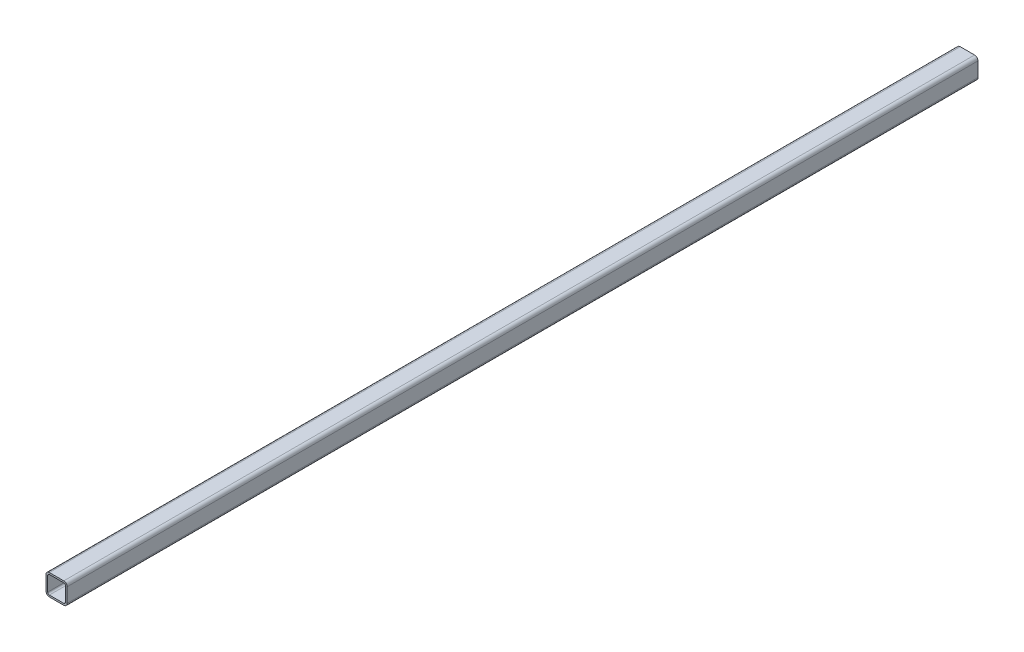
ISO-10303-21;
HEADER;
FILE_DESCRIPTION(('STEP AP214'),'2;1');
FILE_NAME('part.step','',(''),(''),'','','');
FILE_SCHEMA(('AUTOMOTIVE_DESIGN { 1 0 10303 214 1 1 1 1 }'));
ENDSEC;
DATA;
#1=APPLICATION_CONTEXT('core data for automotive mechanical design processes');
#2=APPLICATION_PROTOCOL_DEFINITION('international standard','automotive_design',2000,#1);
#3=PRODUCT_CONTEXT('',#1,'mechanical');
#4=PRODUCT('Part','Part','',(#3));
#5=PRODUCT_RELATED_PRODUCT_CATEGORY('part','',(#4));
#6=PRODUCT_DEFINITION_FORMATION('','',#4);
#7=PRODUCT_DEFINITION_CONTEXT('part definition',#1,'design');
#8=PRODUCT_DEFINITION('design','',#6,#7);
#9=PRODUCT_DEFINITION_SHAPE('','',#8);
#10=(LENGTH_UNIT() NAMED_UNIT(*) SI_UNIT(.MILLI.,.METRE.));
#11=(NAMED_UNIT(*) PLANE_ANGLE_UNIT() SI_UNIT($,.RADIAN.));
#12=(NAMED_UNIT(*) SI_UNIT($,.STERADIAN.) SOLID_ANGLE_UNIT());
#13=UNCERTAINTY_MEASURE_WITH_UNIT(LENGTH_MEASURE(1.E-05),#10,'distance_accuracy_value','');
#14=(GEOMETRIC_REPRESENTATION_CONTEXT(3) GLOBAL_UNCERTAINTY_ASSIGNED_CONTEXT((#13)) GLOBAL_UNIT_ASSIGNED_CONTEXT((#10,
#11,#12)) REPRESENTATION_CONTEXT('',''));
#15=CARTESIAN_POINT('',(0.,0.,0.));
#16=DIRECTION('',(0.,0.,1.));
#17=DIRECTION('',(1.,0.,0.));
#18=AXIS2_PLACEMENT_3D('',#15,#16,#17);
#19=CARTESIAN_POINT('',(379.733333333334,1536.4,880.));
#20=DIRECTION('',(0.,0.,-1.));
#21=DIRECTION('',(0.,1.,0.));
#22=AXIS2_PLACEMENT_3D('',#19,#20,#21);
#23=CYLINDRICAL_SURFACE('',#22,6.39999999999996);
#24=CARTESIAN_POINT('',(379.733333333334,1536.4,-860.));
#25=DIRECTION('',(0.,0.,-1.));
#26=DIRECTION('',(0.,1.,0.));
#27=AXIS2_PLACEMENT_3D('',#24,#25,#26);
#28=CIRCLE('',#27,6.39999999999996);
#29=CARTESIAN_POINT('',(379.733333333334,1530.,-860.));
#30=VERTEX_POINT('',#29);
#31=CARTESIAN_POINT('',(373.333333333334,1536.4,-860.));
#32=VERTEX_POINT('',#31);
#33=EDGE_CURVE('E22',#30,#32,#28,.T.);
#34=ORIENTED_EDGE('',*,*,#33,.F.);
#35=DIRECTION('',(0.,0.,1.));
#36=VECTOR('',#35,1.);
#37=CARTESIAN_POINT('',(379.733333333334,1530.,880.));
#38=LINE('',#37,#36);
#39=CARTESIAN_POINT('',(379.733333333334,1530.,860.));
#40=VERTEX_POINT('',#39);
#41=EDGE_CURVE('E125',#30,#40,#38,.T.);
#42=ORIENTED_EDGE('',*,*,#41,.T.);
#43=CARTESIAN_POINT('',(379.733333333334,1536.4,860.));
#44=DIRECTION('',(0.,0.,-1.));
#45=DIRECTION('',(0.,1.,0.));
#46=AXIS2_PLACEMENT_3D('',#43,#44,#45);
#47=CIRCLE('',#46,6.39999999999996);
#48=CARTESIAN_POINT('',(373.333333333334,1536.4,860.));
#49=VERTEX_POINT('',#48);
#50=EDGE_CURVE('E143',#49,#40,#47,.F.);
#51=ORIENTED_EDGE('',*,*,#50,.F.);
#52=DIRECTION('',(0.,0.,-1.));
#53=VECTOR('',#52,1.);
#54=CARTESIAN_POINT('',(373.333333333334,1536.4,880.));
#55=LINE('',#54,#53);
#56=EDGE_CURVE('E141',#49,#32,#55,.T.);
#57=ORIENTED_EDGE('',*,*,#56,.T.);
#58=EDGE_LOOP('',(#34,#42,#51,#57));
#59=FACE_BOUND('',#58,.T.);
#60=ADVANCED_FACE('F19',(#59),#23,.T.);
#61=CARTESIAN_POINT('',(379.733333333334,1530.,880.));
#62=DIRECTION('',(0.,1.,0.));
#63=DIRECTION('',(0.,0.,1.));
#64=AXIS2_PLACEMENT_3D('',#61,#62,#63);
#65=PLANE('',#64);
#66=DIRECTION('',(1.,0.,0.));
#67=VECTOR('',#66,1.);
#68=CARTESIAN_POINT('',(1180.,1530.,860.));
#69=LINE('',#68,#67);
#70=CARTESIAN_POINT('',(406.933333333334,1530.,860.));
#71=VERTEX_POINT('',#70);
#72=EDGE_CURVE('E211',#40,#71,#69,.T.);
#73=ORIENTED_EDGE('',*,*,#72,.F.);
#74=ORIENTED_EDGE('',*,*,#41,.F.);
#75=DIRECTION('',(1.,0.,0.));
#76=VECTOR('',#75,1.);
#77=CARTESIAN_POINT('',(-1180.,1530.,-860.));
#78=LINE('',#77,#76);
#79=CARTESIAN_POINT('',(406.933333333334,1530.,-860.));
#80=VERTEX_POINT('',#79);
#81=EDGE_CURVE('E139',#80,#30,#78,.F.);
#82=ORIENTED_EDGE('',*,*,#81,.F.);
#83=DIRECTION('',(0.,0.,-1.));
#84=VECTOR('',#83,1.);
#85=CARTESIAN_POINT('',(406.933333333334,1530.,880.));
#86=LINE('',#85,#84);
#87=EDGE_CURVE('E260',#71,#80,#86,.T.);
#88=ORIENTED_EDGE('',*,*,#87,.F.);
#89=EDGE_LOOP('',(#73,#74,#82,#88));
#90=FACE_BOUND('',#89,.T.);
#91=ADVANCED_FACE('F264',(#90),#65,.F.);
#92=CARTESIAN_POINT('',(406.933333333334,1536.4,880.));
#93=DIRECTION('',(0.,0.,-1.));
#94=DIRECTION('',(0.,1.,0.));
#95=AXIS2_PLACEMENT_3D('',#92,#93,#94);
#96=CYLINDRICAL_SURFACE('',#95,6.39999999999996);
#97=CARTESIAN_POINT('',(406.933333333334,1536.4,-860.));
#98=DIRECTION('',(0.,0.,-1.));
#99=DIRECTION('',(0.,1.,0.));
#100=AXIS2_PLACEMENT_3D('',#97,#98,#99);
#101=CIRCLE('',#100,6.39999999999996);
#102=CARTESIAN_POINT('',(413.333333333334,1536.4,-860.));
#103=VERTEX_POINT('',#102);
#104=EDGE_CURVE('E154',#103,#80,#101,.T.);
#105=ORIENTED_EDGE('',*,*,#104,.F.);
#106=DIRECTION('',(0.,0.,1.));
#107=VECTOR('',#106,1.);
#108=CARTESIAN_POINT('',(413.333333333334,1536.4,880.));
#109=LINE('',#108,#107);
#110=CARTESIAN_POINT('',(413.333333333334,1536.4,860.));
#111=VERTEX_POINT('',#110);
#112=EDGE_CURVE('E256',#103,#111,#109,.T.);
#113=ORIENTED_EDGE('',*,*,#112,.T.);
#114=CARTESIAN_POINT('',(406.933333333334,1536.4,860.));
#115=DIRECTION('',(0.,0.,-1.));
#116=DIRECTION('',(0.,1.,0.));
#117=AXIS2_PLACEMENT_3D('',#114,#115,#116);
#118=CIRCLE('',#117,6.39999999999996);
#119=EDGE_CURVE('E212',#71,#111,#118,.F.);
#120=ORIENTED_EDGE('',*,*,#119,.F.);
#121=ORIENTED_EDGE('',*,*,#87,.T.);
#122=EDGE_LOOP('',(#105,#113,#120,#121));
#123=FACE_BOUND('',#122,.T.);
#124=ADVANCED_FACE('F284',(#123),#96,.T.);
#125=CARTESIAN_POINT('',(413.333333333334,1563.6,880.));
#126=DIRECTION('',(-1.,0.,0.));
#127=DIRECTION('',(0.,0.,1.));
#128=AXIS2_PLACEMENT_3D('',#125,#126,#127);
#129=PLANE('',#128);
#130=DIRECTION('',(0.,1.,0.));
#131=VECTOR('',#130,1.);
#132=CARTESIAN_POINT('',(413.333333333334,1563.6,860.));
#133=LINE('',#132,#131);
#134=CARTESIAN_POINT('',(413.333333333334,1563.6,860.));
#135=VERTEX_POINT('',#134);
#136=EDGE_CURVE('E214',#111,#135,#133,.T.);
#137=ORIENTED_EDGE('',*,*,#136,.F.);
#138=ORIENTED_EDGE('',*,*,#112,.F.);
#139=DIRECTION('',(0.,1.,0.));
#140=VECTOR('',#139,1.);
#141=CARTESIAN_POINT('',(413.333333333334,1563.6,-860.));
#142=LINE('',#141,#140);
#143=CARTESIAN_POINT('',(413.333333333334,1563.6,-860.));
#144=VERTEX_POINT('',#143);
#145=EDGE_CURVE('E151',#144,#103,#142,.F.);
#146=ORIENTED_EDGE('',*,*,#145,.F.);
#147=DIRECTION('',(0.,0.,-1.));
#148=VECTOR('',#147,1.);
#149=CARTESIAN_POINT('',(413.333333333334,1563.6,880.));
#150=LINE('',#149,#148);
#151=EDGE_CURVE('E204',#135,#144,#150,.T.);
#152=ORIENTED_EDGE('',*,*,#151,.F.);
#153=EDGE_LOOP('',(#137,#138,#146,#152));
#154=FACE_BOUND('',#153,.T.);
#155=ADVANCED_FACE('F286',(#154),#129,.F.);
#156=CARTESIAN_POINT('',(376.533333333334,1536.4,880.));
#157=DIRECTION('',(1.,0.,0.));
#158=DIRECTION('',(0.,0.,-1.));
#159=AXIS2_PLACEMENT_3D('',#156,#157,#158);
#160=PLANE('',#159);
#161=DIRECTION('',(0.,0.,-1.));
#162=VECTOR('',#161,1.);
#163=CARTESIAN_POINT('',(376.533333333334,1536.4,880.));
#164=LINE('',#163,#162);
#165=CARTESIAN_POINT('',(376.533333333334,1536.4,860.));
#166=VERTEX_POINT('',#165);
#167=CARTESIAN_POINT('',(376.533333333334,1536.4,-860.));
#168=VERTEX_POINT('',#167);
#169=EDGE_CURVE('E147',#166,#168,#164,.T.);
#170=ORIENTED_EDGE('',*,*,#169,.T.);
#171=DIRECTION('',(0.,1.,0.));
#172=VECTOR('',#171,1.);
#173=CARTESIAN_POINT('',(376.533333333334,1563.6,-860.));
#174=LINE('',#173,#172);
#175=CARTESIAN_POINT('',(376.533333333334,1563.6,-860.));
#176=VERTEX_POINT('',#175);
#177=EDGE_CURVE('E189',#176,#168,#174,.F.);
#178=ORIENTED_EDGE('',*,*,#177,.F.);
#179=DIRECTION('',(0.,0.,-1.));
#180=VECTOR('',#179,1.);
#181=CARTESIAN_POINT('',(376.533333333334,1563.6,880.));
#182=LINE('',#181,#180);
#183=CARTESIAN_POINT('',(376.533333333334,1563.6,860.));
#184=VERTEX_POINT('',#183);
#185=EDGE_CURVE('E253',#176,#184,#182,.F.);
#186=ORIENTED_EDGE('',*,*,#185,.T.);
#187=DIRECTION('',(0.,1.,0.));
#188=VECTOR('',#187,1.);
#189=CARTESIAN_POINT('',(376.533333333334,1563.6,860.));
#190=LINE('',#189,#188);
#191=EDGE_CURVE('E218',#166,#184,#190,.T.);
#192=ORIENTED_EDGE('',*,*,#191,.F.);
#193=EDGE_LOOP('',(#170,#178,#186,#192));
#194=FACE_BOUND('',#193,.T.);
#195=ADVANCED_FACE('F304',(#194),#160,.T.);
#196=CARTESIAN_POINT('',(379.733333333334,1563.6,880.));
#197=DIRECTION('',(0.,0.,-1.));
#198=DIRECTION('',(0.,1.,0.));
#199=AXIS2_PLACEMENT_3D('',#196,#197,#198);
#200=CYLINDRICAL_SURFACE('',#199,3.20000000000009);
#201=DIRECTION('',(0.,0.,-1.));
#202=VECTOR('',#201,1.);
#203=CARTESIAN_POINT('',(379.733333333334,1566.8,880.));
#204=LINE('',#203,#202);
#205=CARTESIAN_POINT('',(379.733333333334,1566.8,860.));
#206=VERTEX_POINT('',#205);
#207=CARTESIAN_POINT('',(379.733333333334,1566.8,-860.));
#208=VERTEX_POINT('',#207);
#209=EDGE_CURVE('E248',#206,#208,#204,.T.);
#210=ORIENTED_EDGE('',*,*,#209,.F.);
#211=CARTESIAN_POINT('',(379.733333333334,1563.6,860.));
#212=DIRECTION('',(0.,0.,-1.));
#213=DIRECTION('',(0.,1.,0.));
#214=AXIS2_PLACEMENT_3D('',#211,#212,#213);
#215=CIRCLE('',#214,3.20000000000009);
#216=EDGE_CURVE('E215',#184,#206,#215,.T.);
#217=ORIENTED_EDGE('',*,*,#216,.F.);
#218=ORIENTED_EDGE('',*,*,#185,.F.);
#219=CARTESIAN_POINT('',(379.733333333334,1563.6,-860.));
#220=DIRECTION('',(0.,0.,-1.));
#221=DIRECTION('',(0.,1.,0.));
#222=AXIS2_PLACEMENT_3D('',#219,#220,#221);
#223=CIRCLE('',#222,3.20000000000009);
#224=EDGE_CURVE('E191',#208,#176,#223,.F.);
#225=ORIENTED_EDGE('',*,*,#224,.F.);
#226=EDGE_LOOP('',(#210,#217,#218,#225));
#227=FACE_BOUND('',#226,.T.);
#228=ADVANCED_FACE('F309',(#227),#200,.F.);
#229=CARTESIAN_POINT('',(406.933333333334,1566.8,880.));
#230=DIRECTION('',(0.,-1.,0.));
#231=DIRECTION('',(0.,0.,-1.));
#232=AXIS2_PLACEMENT_3D('',#229,#230,#231);
#233=PLANE('',#232);
#234=ORIENTED_EDGE('',*,*,#209,.T.);
#235=DIRECTION('',(1.,0.,0.));
#236=VECTOR('',#235,1.);
#237=CARTESIAN_POINT('',(-1180.,1566.8,-860.));
#238=LINE('',#237,#236);
#239=CARTESIAN_POINT('',(406.933333333334,1566.8,-860.));
#240=VERTEX_POINT('',#239);
#241=EDGE_CURVE('E192',#240,#208,#238,.F.);
#242=ORIENTED_EDGE('',*,*,#241,.F.);
#243=DIRECTION('',(0.,0.,-1.));
#244=VECTOR('',#243,1.);
#245=CARTESIAN_POINT('',(406.933333333334,1566.8,880.));
#246=LINE('',#245,#244);
#247=CARTESIAN_POINT('',(406.933333333334,1566.8,860.));
#248=VERTEX_POINT('',#247);
#249=EDGE_CURVE('E252',#240,#248,#246,.F.);
#250=ORIENTED_EDGE('',*,*,#249,.T.);
#251=DIRECTION('',(1.,0.,0.));
#252=VECTOR('',#251,1.);
#253=CARTESIAN_POINT('',(1180.,1566.8,860.));
#254=LINE('',#253,#252);
#255=EDGE_CURVE('E217',#206,#248,#254,.T.);
#256=ORIENTED_EDGE('',*,*,#255,.F.);
#257=EDGE_LOOP('',(#234,#242,#250,#256));
#258=FACE_BOUND('',#257,.T.);
#259=ADVANCED_FACE('F316',(#258),#233,.T.);
#260=CARTESIAN_POINT('',(406.933333333334,1563.6,880.));
#261=DIRECTION('',(0.,0.,-1.));
#262=DIRECTION('',(0.,1.,0.));
#263=AXIS2_PLACEMENT_3D('',#260,#261,#262);
#264=CYLINDRICAL_SURFACE('',#263,3.19999999999987);
#265=DIRECTION('',(0.,0.,1.));
#266=VECTOR('',#265,1.);
#267=CARTESIAN_POINT('',(410.133333333334,1563.6,880.));
#268=LINE('',#267,#266);
#269=CARTESIAN_POINT('',(410.133333333334,1563.6,860.));
#270=VERTEX_POINT('',#269);
#271=CARTESIAN_POINT('',(410.133333333334,1563.6,-860.));
#272=VERTEX_POINT('',#271);
#273=EDGE_CURVE('E319',#270,#272,#268,.F.);
#274=ORIENTED_EDGE('',*,*,#273,.F.);
#275=CARTESIAN_POINT('',(406.933333333334,1563.6,860.));
#276=DIRECTION('',(0.,0.,-1.));
#277=DIRECTION('',(0.,1.,0.));
#278=AXIS2_PLACEMENT_3D('',#275,#276,#277);
#279=CIRCLE('',#278,3.19999999999987);
#280=EDGE_CURVE('E219',#248,#270,#279,.T.);
#281=ORIENTED_EDGE('',*,*,#280,.F.);
#282=ORIENTED_EDGE('',*,*,#249,.F.);
#283=CARTESIAN_POINT('',(406.933333333334,1563.6,-860.));
#284=DIRECTION('',(0.,0.,-1.));
#285=DIRECTION('',(0.,1.,0.));
#286=AXIS2_PLACEMENT_3D('',#283,#284,#285);
#287=CIRCLE('',#286,3.19999999999987);
#288=EDGE_CURVE('E183',#272,#240,#287,.F.);
#289=ORIENTED_EDGE('',*,*,#288,.F.);
#290=EDGE_LOOP('',(#274,#281,#282,#289));
#291=FACE_BOUND('',#290,.T.);
#292=ADVANCED_FACE('F320',(#291),#264,.F.);
#293=CARTESIAN_POINT('',(410.133333333334,1563.6,880.));
#294=DIRECTION('',(-1.,0.,0.));
#295=DIRECTION('',(0.,0.,1.));
#296=AXIS2_PLACEMENT_3D('',#293,#294,#295);
#297=PLANE('',#296);
#298=ORIENTED_EDGE('',*,*,#273,.T.);
#299=DIRECTION('',(0.,1.,0.));
#300=VECTOR('',#299,1.);
#301=CARTESIAN_POINT('',(410.133333333334,1563.6,-860.));
#302=LINE('',#301,#300);
#303=CARTESIAN_POINT('',(410.133333333334,1536.4,-860.));
#304=VERTEX_POINT('',#303);
#305=EDGE_CURVE('E178',#304,#272,#302,.T.);
#306=ORIENTED_EDGE('',*,*,#305,.F.);
#307=DIRECTION('',(0.,0.,-1.));
#308=VECTOR('',#307,1.);
#309=CARTESIAN_POINT('',(410.133333333334,1536.4,880.));
#310=LINE('',#309,#308);
#311=CARTESIAN_POINT('',(410.133333333334,1536.4,860.));
#312=VERTEX_POINT('',#311);
#313=EDGE_CURVE('E324',#304,#312,#310,.F.);
#314=ORIENTED_EDGE('',*,*,#313,.T.);
#315=DIRECTION('',(0.,1.,0.));
#316=VECTOR('',#315,1.);
#317=CARTESIAN_POINT('',(410.133333333334,1563.6,860.));
#318=LINE('',#317,#316);
#319=EDGE_CURVE('E221',#270,#312,#318,.F.);
#320=ORIENTED_EDGE('',*,*,#319,.F.);
#321=EDGE_LOOP('',(#298,#306,#314,#320));
#322=FACE_BOUND('',#321,.T.);
#323=ADVANCED_FACE('F326',(#322),#297,.T.);
#324=CARTESIAN_POINT('',(406.933333333334,1536.4,880.));
#325=DIRECTION('',(0.,0.,-1.));
#326=DIRECTION('',(0.,1.,0.));
#327=AXIS2_PLACEMENT_3D('',#324,#325,#326);
#328=CYLINDRICAL_SURFACE('',#327,3.19999999999987);
#329=DIRECTION('',(0.,0.,1.));
#330=VECTOR('',#329,1.);
#331=CARTESIAN_POINT('',(406.933333333334,1533.2,880.));
#332=LINE('',#331,#330);
#333=CARTESIAN_POINT('',(406.933333333334,1533.2,860.));
#334=VERTEX_POINT('',#333);
#335=CARTESIAN_POINT('',(406.933333333334,1533.2,-860.));
#336=VERTEX_POINT('',#335);
#337=EDGE_CURVE('E164',#334,#336,#332,.F.);
#338=ORIENTED_EDGE('',*,*,#337,.F.);
#339=CARTESIAN_POINT('',(406.933333333334,1536.4,860.));
#340=DIRECTION('',(0.,0.,-1.));
#341=DIRECTION('',(0.,1.,0.));
#342=AXIS2_PLACEMENT_3D('',#339,#340,#341);
#343=CIRCLE('',#342,3.19999999999987);
#344=EDGE_CURVE('E222',#312,#334,#343,.T.);
#345=ORIENTED_EDGE('',*,*,#344,.F.);
#346=ORIENTED_EDGE('',*,*,#313,.F.);
#347=CARTESIAN_POINT('',(406.933333333334,1536.4,-860.));
#348=DIRECTION('',(0.,0.,-1.));
#349=DIRECTION('',(0.,1.,0.));
#350=AXIS2_PLACEMENT_3D('',#347,#348,#349);
#351=CIRCLE('',#350,3.19999999999987);
#352=EDGE_CURVE('E184',#336,#304,#351,.F.);
#353=ORIENTED_EDGE('',*,*,#352,.F.);
#354=EDGE_LOOP('',(#338,#345,#346,#353));
#355=FACE_BOUND('',#354,.T.);
#356=ADVANCED_FACE('F329',(#355),#328,.F.);
#357=CARTESIAN_POINT('',(379.733333333334,1533.2,880.));
#358=DIRECTION('',(0.,1.,0.));
#359=DIRECTION('',(0.,0.,1.));
#360=AXIS2_PLACEMENT_3D('',#357,#358,#359);
#361=PLANE('',#360);
#362=ORIENTED_EDGE('',*,*,#337,.T.);
#363=DIRECTION('',(1.,0.,0.));
#364=VECTOR('',#363,1.);
#365=CARTESIAN_POINT('',(-1180.,1533.2,-860.));
#366=LINE('',#365,#364);
#367=CARTESIAN_POINT('',(379.733333333334,1533.2,-860.));
#368=VERTEX_POINT('',#367);
#369=EDGE_CURVE('E185',#368,#336,#366,.T.);
#370=ORIENTED_EDGE('',*,*,#369,.F.);
#371=DIRECTION('',(0.,0.,-1.));
#372=VECTOR('',#371,1.);
#373=CARTESIAN_POINT('',(379.733333333334,1533.2,880.));
#374=LINE('',#373,#372);
#375=CARTESIAN_POINT('',(379.733333333334,1533.2,860.));
#376=VERTEX_POINT('',#375);
#377=EDGE_CURVE('E161',#368,#376,#374,.F.);
#378=ORIENTED_EDGE('',*,*,#377,.T.);
#379=DIRECTION('',(1.,0.,0.));
#380=VECTOR('',#379,1.);
#381=CARTESIAN_POINT('',(1180.,1533.2,860.));
#382=LINE('',#381,#380);
#383=EDGE_CURVE('E224',#334,#376,#382,.F.);
#384=ORIENTED_EDGE('',*,*,#383,.F.);
#385=EDGE_LOOP('',(#362,#370,#378,#384));
#386=FACE_BOUND('',#385,.T.);
#387=ADVANCED_FACE('F298',(#386),#361,.T.);
#388=CARTESIAN_POINT('',(379.733333333334,1536.4,880.));
#389=DIRECTION('',(0.,0.,-1.));
#390=DIRECTION('',(0.,1.,0.));
#391=AXIS2_PLACEMENT_3D('',#388,#389,#390);
#392=CYLINDRICAL_SURFACE('',#391,3.19999999999987);
#393=ORIENTED_EDGE('',*,*,#169,.F.);
#394=CARTESIAN_POINT('',(379.733333333334,1536.4,860.));
#395=DIRECTION('',(0.,0.,-1.));
#396=DIRECTION('',(0.,1.,0.));
#397=AXIS2_PLACEMENT_3D('',#394,#395,#396);
#398=CIRCLE('',#397,3.19999999999987);
#399=EDGE_CURVE('E225',#376,#166,#398,.T.);
#400=ORIENTED_EDGE('',*,*,#399,.F.);
#401=ORIENTED_EDGE('',*,*,#377,.F.);
#402=CARTESIAN_POINT('',(379.733333333334,1536.4,-860.));
#403=DIRECTION('',(0.,0.,-1.));
#404=DIRECTION('',(0.,1.,0.));
#405=AXIS2_PLACEMENT_3D('',#402,#403,#404);
#406=CIRCLE('',#405,3.19999999999987);
#407=EDGE_CURVE('E188',#168,#368,#406,.F.);
#408=ORIENTED_EDGE('',*,*,#407,.F.);
#409=EDGE_LOOP('',(#393,#400,#401,#408));
#410=FACE_BOUND('',#409,.T.);
#411=ADVANCED_FACE('F301',(#410),#392,.F.);
#412=CARTESIAN_POINT('',(373.333333333334,1536.4,880.));
#413=DIRECTION('',(1.,0.,0.));
#414=DIRECTION('',(0.,0.,-1.));
#415=AXIS2_PLACEMENT_3D('',#412,#413,#414);
#416=PLANE('',#415);
#417=DIRECTION('',(0.,1.,0.));
#418=VECTOR('',#417,1.);
#419=CARTESIAN_POINT('',(373.333333333334,1563.6,860.));
#420=LINE('',#419,#418);
#421=CARTESIAN_POINT('',(373.333333333334,1563.6,860.));
#422=VERTEX_POINT('',#421);
#423=EDGE_CURVE('E209',#422,#49,#420,.F.);
#424=ORIENTED_EDGE('',*,*,#423,.F.);
#425=DIRECTION('',(0.,0.,-1.));
#426=VECTOR('',#425,1.);
#427=CARTESIAN_POINT('',(373.333333333334,1563.6,880.));
#428=LINE('',#427,#426);
#429=CARTESIAN_POINT('',(373.333333333334,1563.6,-860.));
#430=VERTEX_POINT('',#429);
#431=EDGE_CURVE('E150',#430,#422,#428,.F.);
#432=ORIENTED_EDGE('',*,*,#431,.F.);
#433=DIRECTION('',(0.,1.,0.));
#434=VECTOR('',#433,1.);
#435=CARTESIAN_POINT('',(373.333333333334,1563.6,-860.));
#436=LINE('',#435,#434);
#437=EDGE_CURVE('E137',#32,#430,#436,.T.);
#438=ORIENTED_EDGE('',*,*,#437,.F.);
#439=ORIENTED_EDGE('',*,*,#56,.F.);
#440=EDGE_LOOP('',(#424,#432,#438,#439));
#441=FACE_BOUND('',#440,.T.);
#442=ADVANCED_FACE('F149',(#441),#416,.F.);
#443=CARTESIAN_POINT('',(-1180.,1563.6,-860.));
#444=DIRECTION('',(0.,0.,-1.));
#445=DIRECTION('',(0.,1.,0.));
#446=AXIS2_PLACEMENT_3D('',#443,#444,#445);
#447=PLANE('',#446);
#448=ORIENTED_EDGE('',*,*,#305,.T.);
#449=ORIENTED_EDGE('',*,*,#288,.T.);
#450=ORIENTED_EDGE('',*,*,#241,.T.);
#451=ORIENTED_EDGE('',*,*,#224,.T.);
#452=ORIENTED_EDGE('',*,*,#177,.T.);
#453=ORIENTED_EDGE('',*,*,#407,.T.);
#454=ORIENTED_EDGE('',*,*,#369,.T.);
#455=ORIENTED_EDGE('',*,*,#352,.T.);
#456=EDGE_LOOP('',(#448,#449,#450,#451,#452,#453,#454,#455));
#457=FACE_BOUND('',#456,.T.);
#458=ORIENTED_EDGE('',*,*,#104,.T.);
#459=ORIENTED_EDGE('',*,*,#81,.T.);
#460=ORIENTED_EDGE('',*,*,#33,.T.);
#461=ORIENTED_EDGE('',*,*,#437,.T.);
#462=CARTESIAN_POINT('',(379.733333333334,1563.6,-860.));
#463=DIRECTION('',(0.,0.,-1.));
#464=DIRECTION('',(0.,1.,0.));
#465=AXIS2_PLACEMENT_3D('',#462,#463,#464);
#466=CIRCLE('',#465,6.39999999999996);
#467=CARTESIAN_POINT('',(379.733333333334,1570.,-860.));
#468=VERTEX_POINT('',#467);
#469=EDGE_CURVE('E160',#468,#430,#466,.F.);
#470=ORIENTED_EDGE('',*,*,#469,.F.);
#471=DIRECTION('',(1.,0.,0.));
#472=VECTOR('',#471,1.);
#473=CARTESIAN_POINT('',(406.933333333334,1570.,-860.));
#474=LINE('',#473,#472);
#475=CARTESIAN_POINT('',(406.933333333334,1570.,-860.));
#476=VERTEX_POINT('',#475);
#477=EDGE_CURVE('E159',#468,#476,#474,.T.);
#478=ORIENTED_EDGE('',*,*,#477,.T.);
#479=CARTESIAN_POINT('',(406.933333333334,1563.6,-860.));
#480=DIRECTION('',(0.,0.,-1.));
#481=DIRECTION('',(0.,1.,0.));
#482=AXIS2_PLACEMENT_3D('',#479,#480,#481);
#483=CIRCLE('',#482,6.39999999999996);
#484=EDGE_CURVE('E205',#144,#476,#483,.F.);
#485=ORIENTED_EDGE('',*,*,#484,.F.);
#486=ORIENTED_EDGE('',*,*,#145,.T.);
#487=EDGE_LOOP('',(#458,#459,#460,#461,#470,#478,#485,#486));
#488=FACE_BOUND('',#487,.T.);
#489=ADVANCED_FACE('F133',(#457,#488),#447,.T.);
#490=CARTESIAN_POINT('',(406.933333333334,1563.6,880.));
#491=DIRECTION('',(0.,0.,-1.));
#492=DIRECTION('',(0.,1.,0.));
#493=AXIS2_PLACEMENT_3D('',#490,#491,#492);
#494=CYLINDRICAL_SURFACE('',#493,6.39999999999996);
#495=ORIENTED_EDGE('',*,*,#484,.T.);
#496=DIRECTION('',(0.,0.,-1.));
#497=VECTOR('',#496,1.);
#498=CARTESIAN_POINT('',(406.933333333334,1570.,880.));
#499=LINE('',#498,#497);
#500=CARTESIAN_POINT('',(406.933333333334,1570.,860.));
#501=VERTEX_POINT('',#500);
#502=EDGE_CURVE('E239',#476,#501,#499,.F.);
#503=ORIENTED_EDGE('',*,*,#502,.T.);
#504=CARTESIAN_POINT('',(406.933333333334,1563.6,860.));
#505=DIRECTION('',(0.,0.,-1.));
#506=DIRECTION('',(0.,1.,0.));
#507=AXIS2_PLACEMENT_3D('',#504,#505,#506);
#508=CIRCLE('',#507,6.39999999999996);
#509=EDGE_CURVE('E207',#135,#501,#508,.F.);
#510=ORIENTED_EDGE('',*,*,#509,.F.);
#511=ORIENTED_EDGE('',*,*,#151,.T.);
#512=EDGE_LOOP('',(#495,#503,#510,#511));
#513=FACE_BOUND('',#512,.T.);
#514=ADVANCED_FACE('F280',(#513),#494,.T.);
#515=CARTESIAN_POINT('',(1180.,1563.6,860.));
#516=DIRECTION('',(0.,0.,1.));
#517=DIRECTION('',(1.,0.,0.));
#518=AXIS2_PLACEMENT_3D('',#515,#516,#517);
#519=PLANE('',#518);
#520=ORIENTED_EDGE('',*,*,#383,.T.);
#521=ORIENTED_EDGE('',*,*,#399,.T.);
#522=ORIENTED_EDGE('',*,*,#191,.T.);
#523=ORIENTED_EDGE('',*,*,#216,.T.);
#524=ORIENTED_EDGE('',*,*,#255,.T.);
#525=ORIENTED_EDGE('',*,*,#280,.T.);
#526=ORIENTED_EDGE('',*,*,#319,.T.);
#527=ORIENTED_EDGE('',*,*,#344,.T.);
#528=EDGE_LOOP('',(#520,#521,#522,#523,#524,#525,#526,#527));
#529=FACE_BOUND('',#528,.T.);
#530=ORIENTED_EDGE('',*,*,#119,.T.);
#531=ORIENTED_EDGE('',*,*,#136,.T.);
#532=ORIENTED_EDGE('',*,*,#509,.T.);
#533=DIRECTION('',(1.,0.,0.));
#534=VECTOR('',#533,1.);
#535=CARTESIAN_POINT('',(406.933333333334,1570.,860.));
#536=LINE('',#535,#534);
#537=CARTESIAN_POINT('',(379.733333333334,1570.,860.));
#538=VERTEX_POINT('',#537);
#539=EDGE_CURVE('E28',#501,#538,#536,.F.);
#540=ORIENTED_EDGE('',*,*,#539,.T.);
#541=CARTESIAN_POINT('',(379.733333333334,1563.6,860.));
#542=DIRECTION('',(0.,0.,-1.));
#543=DIRECTION('',(0.,1.,0.));
#544=AXIS2_PLACEMENT_3D('',#541,#542,#543);
#545=CIRCLE('',#544,6.39999999999996);
#546=EDGE_CURVE('E36',#422,#538,#545,.T.);
#547=ORIENTED_EDGE('',*,*,#546,.F.);
#548=ORIENTED_EDGE('',*,*,#423,.T.);
#549=ORIENTED_EDGE('',*,*,#50,.T.);
#550=ORIENTED_EDGE('',*,*,#72,.T.);
#551=EDGE_LOOP('',(#530,#531,#532,#540,#547,#548,#549,#550));
#552=FACE_BOUND('',#551,.T.);
#553=ADVANCED_FACE('F267',(#529,#552),#519,.T.);
#554=CARTESIAN_POINT('',(379.733333333334,1563.6,880.));
#555=DIRECTION('',(0.,0.,-1.));
#556=DIRECTION('',(0.,1.,0.));
#557=AXIS2_PLACEMENT_3D('',#554,#555,#556);
#558=CYLINDRICAL_SURFACE('',#557,6.39999999999996);
#559=ORIENTED_EDGE('',*,*,#469,.T.);
#560=ORIENTED_EDGE('',*,*,#431,.T.);
#561=ORIENTED_EDGE('',*,*,#546,.T.);
#562=DIRECTION('',(0.,0.,-1.));
#563=VECTOR('',#562,1.);
#564=CARTESIAN_POINT('',(379.733333333334,1570.,880.));
#565=LINE('',#564,#563);
#566=EDGE_CURVE('E12',#538,#468,#565,.T.);
#567=ORIENTED_EDGE('',*,*,#566,.T.);
#568=EDGE_LOOP('',(#559,#560,#561,#567));
#569=FACE_BOUND('',#568,.T.);
#570=ADVANCED_FACE('F269',(#569),#558,.T.);
#571=CARTESIAN_POINT('',(406.933333333334,1570.,880.));
#572=DIRECTION('',(0.,-1.,0.));
#573=DIRECTION('',(0.,0.,-1.));
#574=AXIS2_PLACEMENT_3D('',#571,#572,#573);
#575=PLANE('',#574);
#576=ORIENTED_EDGE('',*,*,#539,.F.);
#577=ORIENTED_EDGE('',*,*,#502,.F.);
#578=ORIENTED_EDGE('',*,*,#477,.F.);
#579=ORIENTED_EDGE('',*,*,#566,.F.);
#580=EDGE_LOOP('',(#576,#577,#578,#579));
#581=FACE_BOUND('',#580,.T.);
#582=ADVANCED_FACE('F277',(#581),#575,.F.);
#583=CLOSED_SHELL('',(#60,#91,#124,#155,#195,#228,#259,#292,#323,#356,#387,#411,#442,#489,#514,
#553,#570,#582));
#584=MANIFOLD_SOLID_BREP('B1',#583);
#585=ADVANCED_BREP_SHAPE_REPRESENTATION('',(#18,#584),#14);
#586=SHAPE_DEFINITION_REPRESENTATION(#9,#585);
ENDSEC;
END-ISO-10303-21;
